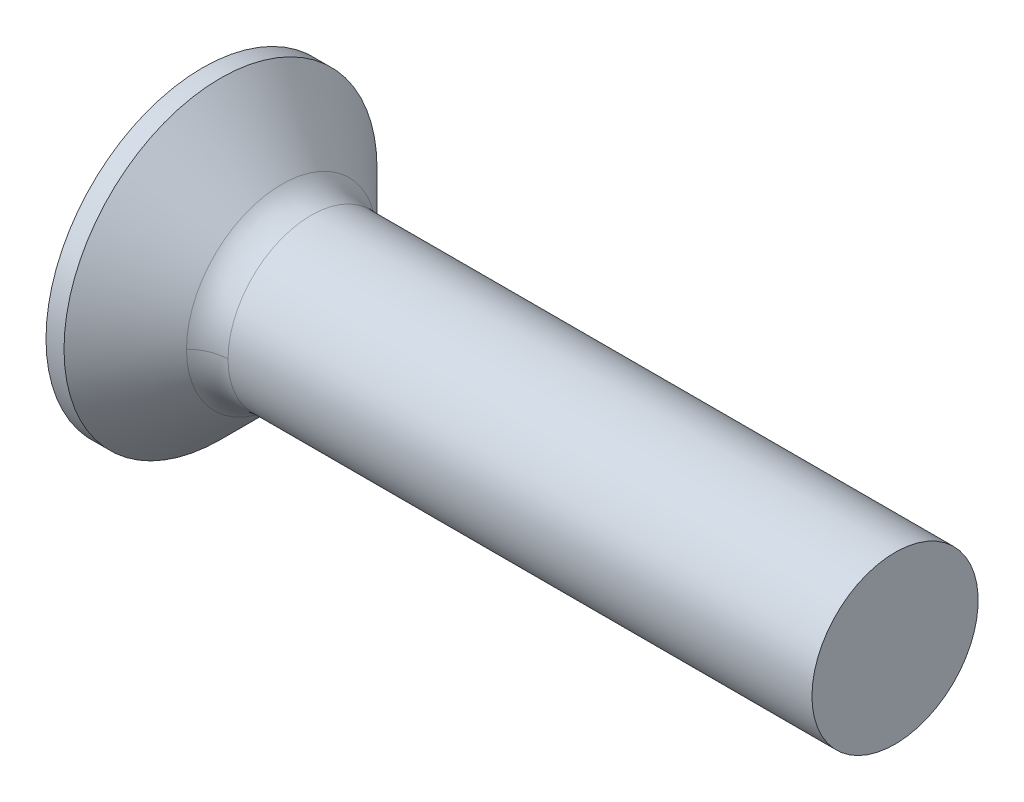
ISO-10303-21;
HEADER;
FILE_DESCRIPTION(('STEP AP214'),'2;1');
FILE_NAME('part.step','',(''),(''),'','','');
FILE_SCHEMA(('AUTOMOTIVE_DESIGN { 1 0 10303 214 1 1 1 1 }'));
ENDSEC;
DATA;
#1=APPLICATION_CONTEXT('core data for automotive mechanical design processes');
#2=APPLICATION_PROTOCOL_DEFINITION('international standard','automotive_design',2000,#1);
#3=PRODUCT_CONTEXT('',#1,'mechanical');
#4=PRODUCT('Part','Part','',(#3));
#5=PRODUCT_RELATED_PRODUCT_CATEGORY('part','',(#4));
#6=PRODUCT_DEFINITION_FORMATION('','',#4);
#7=PRODUCT_DEFINITION_CONTEXT('part definition',#1,'design');
#8=PRODUCT_DEFINITION('design','',#6,#7);
#9=PRODUCT_DEFINITION_SHAPE('','',#8);
#10=(LENGTH_UNIT() NAMED_UNIT(*) SI_UNIT(.MILLI.,.METRE.));
#11=(NAMED_UNIT(*) PLANE_ANGLE_UNIT() SI_UNIT($,.RADIAN.));
#12=(NAMED_UNIT(*) SI_UNIT($,.STERADIAN.) SOLID_ANGLE_UNIT());
#13=UNCERTAINTY_MEASURE_WITH_UNIT(LENGTH_MEASURE(1.E-05),#10,'distance_accuracy_value','');
#14=(GEOMETRIC_REPRESENTATION_CONTEXT(3) GLOBAL_UNCERTAINTY_ASSIGNED_CONTEXT((#13)) GLOBAL_UNIT_ASSIGNED_CONTEXT((#10,
#11,#12)) REPRESENTATION_CONTEXT('',''));
#15=CARTESIAN_POINT('',(0.,0.,0.));
#16=DIRECTION('',(0.,0.,1.));
#17=DIRECTION('',(1.,0.,0.));
#18=AXIS2_PLACEMENT_3D('',#15,#16,#17);
#19=CARTESIAN_POINT('',(25.,-3.036,3.036));
#20=DIRECTION('',(1.,0.,0.));
#21=DIRECTION('',(0.,0.,-1.));
#22=AXIS2_PLACEMENT_3D('',#19,#20,#21);
#23=PLANE('',#22);
#24=CARTESIAN_POINT('',(25.,0.,0.));
#25=DIRECTION('',(-1.,0.,0.));
#26=DIRECTION('',(0.,0.,1.));
#27=AXIS2_PLACEMENT_3D('',#24,#25,#26);
#28=CIRCLE('',#27,3.);
#29=CARTESIAN_POINT('',(25.,0.,3.));
#30=VERTEX_POINT('',#29);
#31=EDGE_CURVE('E20',#30,#30,#28,.F.);
#32=ORIENTED_EDGE('',*,*,#31,.T.);
#33=EDGE_LOOP('',(#32));
#34=FACE_BOUND('',#33,.T.);
#35=ADVANCED_FACE('F16',(#34),#23,.T.);
#36=CARTESIAN_POINT('',(25.,0.,0.));
#37=DIRECTION('',(-1.,0.,0.));
#38=DIRECTION('',(0.,0.,1.));
#39=AXIS2_PLACEMENT_3D('',#36,#37,#38);
#40=CYLINDRICAL_SURFACE('',#39,3.);
#41=ORIENTED_EDGE('',*,*,#31,.F.);
#42=EDGE_LOOP('',(#41));
#43=FACE_BOUND('',#42,.T.);
#44=CARTESIAN_POINT('',(3.92132034347785,0.,0.));
#45=DIRECTION('',(1.,0.,0.));
#46=DIRECTION('',(0.,0.,-1.));
#47=AXIS2_PLACEMENT_3D('',#44,#45,#46);
#48=CIRCLE('',#47,2.99999999996667);
#49=CARTESIAN_POINT('',(3.92132034360542,-3.07655142772997E-10,-2.999999999975));
#50=VERTEX_POINT('',#49);
#51=CARTESIAN_POINT('',(3.9213203434734,-1.346904426431E-10,2.999999999975));
#52=VERTEX_POINT('',#51);
#53=EDGE_CURVE('E250',#50,#52,#48,.T.);
#54=ORIENTED_EDGE('',*,*,#53,.T.);
#55=CARTESIAN_POINT('',(3.92132034347785,0.,0.));
#56=DIRECTION('',(1.,0.,0.));
#57=DIRECTION('',(0.,0.,-1.));
#58=AXIS2_PLACEMENT_3D('',#55,#56,#57);
#59=CIRCLE('',#58,2.99999999996667);
#60=EDGE_CURVE('E239',#52,#50,#59,.T.);
#61=ORIENTED_EDGE('',*,*,#60,.T.);
#62=EDGE_LOOP('',(#54,#61));
#63=FACE_BOUND('',#62,.T.);
#64=ADVANCED_FACE('F518',(#43,#63),#40,.T.);
#65=CARTESIAN_POINT('',(4.071070469,0.,3.007493752));
#66=CARTESIAN_POINT('',(4.071070469,6.014987504,3.007493752));
#67=CARTESIAN_POINT('',(4.071070469,6.014987504,-3.007493752));
#68=CARTESIAN_POINT('',(4.071070469,0.,-3.007493752));
#69=CARTESIAN_POINT('',(3.559894839,0.,2.956205113));
#70=CARTESIAN_POINT('',(3.559894839,5.912410226,2.956205113));
#71=CARTESIAN_POINT('',(3.559894839,5.912410226,-2.956205113));
#72=CARTESIAN_POINT('',(3.559894839,0.,-2.956205113));
#73=CARTESIAN_POINT('',(3.085258935,0.,3.152805742));
#74=CARTESIAN_POINT('',(3.085258935,6.305611483,3.152805742));
#75=CARTESIAN_POINT('',(3.085258935,6.305611483,-3.152805742));
#76=CARTESIAN_POINT('',(3.085258935,0.,-3.152805742));
#77=CARTESIAN_POINT('',(2.760069726,0.,3.55052804));
#78=CARTESIAN_POINT('',(2.760069726,7.10105608,3.55052804));
#79=CARTESIAN_POINT('',(2.760069726,7.10105608,-3.55052804));
#80=CARTESIAN_POINT('',(2.760069726,0.,-3.55052804));
#81=(BOUNDED_SURFACE() B_SPLINE_SURFACE(3,3,((#65,#66,#67,#68),(#69,#70,#71,#72),(#73,#74,#75,
#76),(#77,#78,#79,#80)),.UNSPECIFIED.,.F.,.F.,.F.) B_SPLINE_SURFACE_WITH_KNOTS((4,4),(4,4),(0.,
1.),(0.,1.),.UNSPECIFIED.) GEOMETRIC_REPRESENTATION_ITEM() RATIONAL_B_SPLINE_SURFACE(((1.,
0.333333333333333,0.333333333333333,1.),(0.920706259011135,0.306902086337045,0.306902086337045,
0.920706259011135),(0.920706259011135,0.306902086337045,0.306902086337045,0.920706259011135),
(1.,0.333333333333333,0.333333333333333,1.))) REPRESENTATION_ITEM('') SURFACE());
#82=CARTESIAN_POINT('',(2.86066017200004,0.,0.));
#83=DIRECTION('',(-1.,0.,0.));
#84=DIRECTION('',(0.,0.,1.));
#85=AXIS2_PLACEMENT_3D('',#82,#83,#84);
#86=CIRCLE('',#85,3.439339828);
#87=CARTESIAN_POINT('',(2.86066017203004,-1.05813058582819E-09,-3.43933982801549));
#88=VERTEX_POINT('',#87);
#89=CARTESIAN_POINT('',(2.86066017202489,-3.08830802555573E-10,3.43933982802064));
#90=VERTEX_POINT('',#89);
#91=EDGE_CURVE('E227',#88,#90,#86,.F.);
#92=CARTESIAN_POINT('',(4.071070469,0.,3.007493752));
#93=CARTESIAN_POINT('',(3.559894839,0.,2.956205113));
#94=CARTESIAN_POINT('',(3.085258935,0.,3.152805742));
#95=CARTESIAN_POINT('',(2.760069726,0.,3.55052804));
#96=(BOUNDED_CURVE() B_SPLINE_CURVE(3,(#92,#93,#94,#95),.UNSPECIFIED.,.F.,
.F.) B_SPLINE_CURVE_WITH_KNOTS((4,4),(0.,1.),
.UNSPECIFIED.) CURVE() GEOMETRIC_REPRESENTATION_ITEM() RATIONAL_B_SPLINE_CURVE((1.,
0.920706259011135,0.920706259011135,1.)) REPRESENTATION_ITEM(''));
#97=EDGE_CURVE('E244',#90,#52,#96,.F.);
#98=CARTESIAN_POINT('',(4.071070469,0.,-3.007493752));
#99=CARTESIAN_POINT('',(3.559894839,0.,-2.956205113));
#100=CARTESIAN_POINT('',(3.085258935,0.,-3.152805742));
#101=CARTESIAN_POINT('',(2.760069726,0.,-3.55052804));
#102=(BOUNDED_CURVE() B_SPLINE_CURVE(3,(#98,#99,#100,#101),.UNSPECIFIED.,.F.,
.F.) B_SPLINE_CURVE_WITH_KNOTS((4,4),(0.,1.),
.UNSPECIFIED.) CURVE() GEOMETRIC_REPRESENTATION_ITEM() RATIONAL_B_SPLINE_CURVE((1.,
0.920706259011135,0.920706259011135,1.)) REPRESENTATION_ITEM(''));
#103=EDGE_CURVE('E230',#50,#88,#102,.T.);
#104=ORIENTED_EDGE('',*,*,#91,.T.);
#105=ORIENTED_EDGE('',*,*,#97,.T.);
#106=ORIENTED_EDGE('',*,*,#53,.F.);
#107=ORIENTED_EDGE('',*,*,#103,.T.);
#108=EDGE_LOOP('',(#104,#105,#106,#107));
#109=FACE_BOUND('',#108,.T.);
#110=ADVANCED_FACE('F502',(#109),#81,.F.);
#111=CARTESIAN_POINT('',(4.071070469,0.,-3.007493752));
#112=CARTESIAN_POINT('',(4.071070469,-6.014987504,-3.007493752));
#113=CARTESIAN_POINT('',(4.071070469,-6.014987504,3.007493752));
#114=CARTESIAN_POINT('',(4.071070469,0.,3.007493752));
#115=CARTESIAN_POINT('',(3.559894839,0.,-2.956205113));
#116=CARTESIAN_POINT('',(3.559894839,-5.912410226,-2.956205113));
#117=CARTESIAN_POINT('',(3.559894839,-5.912410226,2.956205113));
#118=CARTESIAN_POINT('',(3.559894839,0.,2.956205113));
#119=CARTESIAN_POINT('',(3.085258935,0.,-3.152805742));
#120=CARTESIAN_POINT('',(3.085258935,-6.305611483,-3.152805742));
#121=CARTESIAN_POINT('',(3.085258935,-6.305611483,3.152805742));
#122=CARTESIAN_POINT('',(3.085258935,0.,3.152805742));
#123=CARTESIAN_POINT('',(2.760069726,0.,-3.55052804));
#124=CARTESIAN_POINT('',(2.760069726,-7.10105608,-3.55052804));
#125=CARTESIAN_POINT('',(2.760069726,-7.10105608,3.55052804));
#126=CARTESIAN_POINT('',(2.760069726,0.,3.55052804));
#127=(BOUNDED_SURFACE() B_SPLINE_SURFACE(3,3,((#111,#112,#113,#114),(#115,#116,#117,#118),(#119,
#120,#121,#122),(#123,#124,#125,#126)),.UNSPECIFIED.,.F.,.F.,
.F.) B_SPLINE_SURFACE_WITH_KNOTS((4,4),(4,4),(0.,1.),(0.,1.),
.UNSPECIFIED.) GEOMETRIC_REPRESENTATION_ITEM() RATIONAL_B_SPLINE_SURFACE(((1.,0.333333333333333,
0.333333333333333,1.),(0.920706259011135,0.306902086337045,0.306902086337045,0.920706259011135),
(0.920706259011135,0.306902086337045,0.306902086337045,0.920706259011135),(1.,0.333333333333333,
0.333333333333333,1.))) REPRESENTATION_ITEM('') SURFACE());
#128=CARTESIAN_POINT('',(2.86066017200004,0.,0.));
#129=DIRECTION('',(-1.,0.,0.));
#130=DIRECTION('',(0.,0.,1.));
#131=AXIS2_PLACEMENT_3D('',#128,#129,#130);
#132=CIRCLE('',#131,3.439339828);
#133=EDGE_CURVE('E223',#90,#88,#132,.F.);
#134=ORIENTED_EDGE('',*,*,#103,.F.);
#135=ORIENTED_EDGE('',*,*,#60,.F.);
#136=ORIENTED_EDGE('',*,*,#97,.F.);
#137=ORIENTED_EDGE('',*,*,#133,.T.);
#138=EDGE_LOOP('',(#134,#135,#136,#137));
#139=FACE_BOUND('',#138,.T.);
#140=ADVANCED_FACE('F495',(#139),#127,.F.);
#141=CARTESIAN_POINT('',(2.860660172,0.,0.));
#142=DIRECTION('',(-1.,0.,0.));
#143=DIRECTION('',(0.,-1.,0.));
#144=AXIS2_PLACEMENT_3D('',#141,#142,#143);
#145=CONICAL_SURFACE('',#144,3.439339828,0.785398163397448);
#146=ORIENTED_EDGE('',*,*,#133,.F.);
#147=ORIENTED_EDGE('',*,*,#91,.F.);
#148=EDGE_LOOP('',(#146,#147));
#149=FACE_BOUND('',#148,.T.);
#150=CARTESIAN_POINT('',(0.65,0.,0.));
#151=DIRECTION('',(-1.,0.,0.));
#152=DIRECTION('',(0.,0.,1.));
#153=AXIS2_PLACEMENT_3D('',#150,#151,#152);
#154=CIRCLE('',#153,5.65);
#155=CARTESIAN_POINT('',(0.65,0.,5.65));
#156=VERTEX_POINT('',#155);
#157=EDGE_CURVE('E209',#156,#156,#154,.F.);
#158=ORIENTED_EDGE('',*,*,#157,.T.);
#159=EDGE_LOOP('',(#158));
#160=FACE_BOUND('',#159,.T.);
#161=ADVANCED_FACE('F493',(#149,#160),#145,.T.);
#162=CARTESIAN_POINT('',(3.45,-1.579893512,-0.71));
#163=DIRECTION('',(-0.446197800689229,0.894934367794698,0.));
#164=DIRECTION('',(-0.894934367794698,-0.446197800689229,0.));
#165=AXIS2_PLACEMENT_3D('',#162,#163,#164);
#166=PLANE('',#165);
#167=DIRECTION('',(-0.894934367740282,-0.44619780079837,0.));
#168=VECTOR('',#167,1.);
#169=CARTESIAN_POINT('',(3.45,-1.57989351138299,0.71));
#170=LINE('',#169,#168);
#171=CARTESIAN_POINT('',(3.45,-1.5798935116915,0.71));
#172=VERTEX_POINT('',#171);
#173=CARTESIAN_POINT('',(-9.15153369751565E-12,-3.29999999998164,0.710000002242601));
#174=VERTEX_POINT('',#173);
#175=EDGE_CURVE('E206',#172,#174,#170,.T.);
#176=ORIENTED_EDGE('',*,*,#175,.F.);
#177=DIRECTION('',(0.,0.,-1.));
#178=VECTOR('',#177,1.);
#179=CARTESIAN_POINT('',(3.45,-1.579893512,0.));
#180=LINE('',#179,#178);
#181=CARTESIAN_POINT('',(3.45,-1.5798935116915,-0.71));
#182=VERTEX_POINT('',#181);
#183=EDGE_CURVE('E221',#172,#182,#180,.T.);
#184=ORIENTED_EDGE('',*,*,#183,.T.);
#185=DIRECTION('',(0.894934367740282,0.44619780079837,0.));
#186=VECTOR('',#185,1.);
#187=CARTESIAN_POINT('',(0.,-3.29999999990833,-0.71));
#188=LINE('',#187,#186);
#189=CARTESIAN_POINT('',(-9.15155371455694E-12,-3.29999999998164,-0.7100000022426));
#190=VERTEX_POINT('',#189);
#191=EDGE_CURVE('E158',#190,#182,#188,.T.);
#192=ORIENTED_EDGE('',*,*,#191,.F.);
#193=DIRECTION('',(0.,0.,1.));
#194=VECTOR('',#193,1.);
#195=CARTESIAN_POINT('',(0.,-3.3,0.));
#196=LINE('',#195,#194);
#197=EDGE_CURVE('E164',#190,#174,#196,.T.);
#198=ORIENTED_EDGE('',*,*,#197,.T.);
#199=EDGE_LOOP('',(#176,#184,#192,#198));
#200=FACE_BOUND('',#199,.T.);
#201=ADVANCED_FACE('F481',(#200),#166,.T.);
#202=CARTESIAN_POINT('',(3.45,0.,0.));
#203=DIRECTION('',(-1.,0.,0.));
#204=DIRECTION('',(0.,0.,1.));
#205=AXIS2_PLACEMENT_3D('',#202,#203,#204);
#206=CONICAL_SURFACE('',#205,1.2805,0.0698131700206101);
#207=CARTESIAN_POINT('',(0.,0.,0.));
#208=DIRECTION('',(-1.,0.,0.));
#209=DIRECTION('',(0.,0.,1.));
#210=AXIS2_PLACEMENT_3D('',#207,#208,#209);
#211=CIRCLE('',#210,1.521747501);
#212=CARTESIAN_POINT('',(-1.98757490879553E-11,-0.7100000022426,-1.34596264941472));
#213=VERTEX_POINT('',#212);
#214=CARTESIAN_POINT('',(-2.0018081073557E-11,-1.34596264941473,-0.7100000022426));
#215=VERTEX_POINT('',#214);
#216=EDGE_CURVE('E138',#213,#215,#211,.T.);
#217=ORIENTED_EDGE('',*,*,#216,.T.);
#218=CARTESIAN_POINT('',(3.44999999996933,-1.06563607763892,-0.709999999965281));
#219=CARTESIAN_POINT('',(3.05239804319664,-1.09903290978623,-0.709999999987832));
#220=CARTESIAN_POINT('',(2.65475821752246,-1.13197492179622,-0.709999999996809));
#221=CARTESIAN_POINT('',(1.859418568149,-1.19711780637158,-0.710000000003191));
#222=CARTESIAN_POINT('',(1.46171874456479,-1.22931868034064,-0.710000000000595));
#223=CARTESIAN_POINT('',(0.886672014067367,-1.2754623780766,-0.709999999999735));
#224=CARTESIAN_POINT('',(0.70934344088065,-1.2896345562043,-0.709999999999868));
#225=CARTESIAN_POINT('',(0.354677833209052,-1.31787453536712,-0.710000000000133));
#226=CARTESIAN_POINT('',(0.177340798717209,-1.33194233631483,-0.710000000000265));
#227=CARTESIAN_POINT('',(-4.00360912278943E-11,-1.34596265059929,-0.71));
#228=B_SPLINE_CURVE_WITH_KNOTS('',3,(#218,#219,#220,#221,#222,#223,#224,#225,#226,#227),
.UNSPECIFIED.,.F.,.F.,(4,2,2,2,4),(0.,1.19700553542681,2.39400880358524,2.92769077313542,
3.46137318953635),.UNSPECIFIED.);
#229=CARTESIAN_POINT('',(3.44999999999998,-1.06563607782568,-0.709999999743873));
#230=VERTEX_POINT('',#229);
#231=EDGE_CURVE('E144',#230,#215,#228,.T.);
#232=ORIENTED_EDGE('',*,*,#231,.F.);
#233=CARTESIAN_POINT('',(3.44999999999995,0.,0.));
#234=DIRECTION('',(-1.,0.,0.));
#235=DIRECTION('',(0.,0.,1.));
#236=AXIS2_PLACEMENT_3D('',#233,#234,#235);
#237=CIRCLE('',#236,1.2805);
#238=CARTESIAN_POINT('',(3.44999999999995,-0.709999999757469,-1.06563607781662));
#239=VERTEX_POINT('',#238);
#240=EDGE_CURVE('E149',#230,#239,#237,.F.);
#241=ORIENTED_EDGE('',*,*,#240,.T.);
#242=CARTESIAN_POINT('',(-3.97514937370692E-11,-0.71,-1.34596265059927));
#243=CARTESIAN_POINT('',(0.472697147041394,-0.71,-1.30857045299318));
#244=CARTESIAN_POINT('',(0.945371396486863,-0.71,-1.2708795223401));
#245=CARTESIAN_POINT('',(1.89064711681851,-0.71,-1.19461362364889));
#246=CARTESIAN_POINT('',(2.36324858790939,-0.71,-1.15603865814475));
#247=CARTESIAN_POINT('',(3.04054381210254,-0.71,-1.09991132788619));
#248=CARTESIAN_POINT('',(3.24527698184166,-0.71,-1.08283447895016));
#249=CARTESIAN_POINT('',(3.44999999997136,-0.71,-1.06563607765744));
#250=B_SPLINE_CURVE_WITH_KNOTS('',3,(#242,#243,#244,#245,#246,#247,#248,#249),.UNSPECIFIED.,.F.,
.F.,(4,2,2,4),(0.,1.42252243057653,2.84504078416987,3.4613730974833),.UNSPECIFIED.);
#251=EDGE_CURVE('E146',#213,#239,#250,.T.);
#252=ORIENTED_EDGE('',*,*,#251,.F.);
#253=EDGE_LOOP('',(#217,#232,#241,#252));
#254=FACE_BOUND('',#253,.T.);
#255=ADVANCED_FACE('F143',(#254),#206,.F.);
#256=CARTESIAN_POINT('',(3.45,0.71,-1.579893512));
#257=DIRECTION('',(-0.446197800689229,0.,0.894934367794698));
#258=DIRECTION('',(-0.894934367794698,0.,-0.446197800689229));
#259=AXIS2_PLACEMENT_3D('',#256,#257,#258);
#260=PLANE('',#259);
#261=DIRECTION('',(-0.894934367740282,0.,-0.44619780079837));
#262=VECTOR('',#261,1.);
#263=CARTESIAN_POINT('',(3.45,-0.71,-1.57989351138299));
#264=LINE('',#263,#262);
#265=CARTESIAN_POINT('',(3.45,-0.71,-1.5798935116915));
#266=VERTEX_POINT('',#265);
#267=CARTESIAN_POINT('',(-9.15153369751565E-12,-0.7100000022426,-3.29999999998164));
#268=VERTEX_POINT('',#267);
#269=EDGE_CURVE('E202',#266,#268,#264,.T.);
#270=ORIENTED_EDGE('',*,*,#269,.F.);
#271=DIRECTION('',(0.,1.,0.));
#272=VECTOR('',#271,1.);
#273=CARTESIAN_POINT('',(3.45,0.,-1.579893512));
#274=LINE('',#273,#272);
#275=CARTESIAN_POINT('',(3.45,0.71,-1.5798935116915));
#276=VERTEX_POINT('',#275);
#277=EDGE_CURVE('E218',#266,#276,#274,.T.);
#278=ORIENTED_EDGE('',*,*,#277,.T.);
#279=DIRECTION('',(0.894934367740282,0.,0.44619780079837));
#280=VECTOR('',#279,1.);
#281=CARTESIAN_POINT('',(0.,0.71,-3.29999999990833));
#282=LINE('',#281,#280);
#283=CARTESIAN_POINT('',(-9.15155371455694E-12,0.710000002242601,-3.29999999998164));
#284=VERTEX_POINT('',#283);
#285=EDGE_CURVE('E381',#284,#276,#282,.T.);
#286=ORIENTED_EDGE('',*,*,#285,.F.);
#287=DIRECTION('',(0.,-1.,0.));
#288=VECTOR('',#287,1.);
#289=CARTESIAN_POINT('',(0.,0.,-3.3));
#290=LINE('',#289,#288);
#291=EDGE_CURVE('E148',#284,#268,#290,.T.);
#292=ORIENTED_EDGE('',*,*,#291,.T.);
#293=EDGE_LOOP('',(#270,#278,#286,#292));
#294=FACE_BOUND('',#293,.T.);
#295=ADVANCED_FACE('F402',(#294),#260,.T.);
#296=CARTESIAN_POINT('',(3.45,0.,0.));
#297=DIRECTION('',(-1.,0.,0.));
#298=DIRECTION('',(0.,0.,1.));
#299=AXIS2_PLACEMENT_3D('',#296,#297,#298);
#300=CONICAL_SURFACE('',#299,1.2805,0.0698131700206101);
#301=CARTESIAN_POINT('',(3.44999999999995,0.,0.));
#302=DIRECTION('',(-1.,0.,0.));
#303=DIRECTION('',(0.,0.,1.));
#304=AXIS2_PLACEMENT_3D('',#301,#302,#303);
#305=CIRCLE('',#304,1.2805);
#306=CARTESIAN_POINT('',(3.44999999999998,0.709999999853156,-1.06563607775287));
#307=VERTEX_POINT('',#306);
#308=CARTESIAN_POINT('',(3.44999999999352,1.06563607753498,-0.710000000181004));
#309=VERTEX_POINT('',#308);
#310=EDGE_CURVE('E213',#307,#309,#305,.F.);
#311=ORIENTED_EDGE('',*,*,#310,.T.);
#312=CARTESIAN_POINT('',(-4.20398786480878E-11,1.34596265059945,-0.71));
#313=CARTESIAN_POINT('',(0.472697147039157,1.30857045299336,-0.71));
#314=CARTESIAN_POINT('',(0.945371396484674,1.27087952234027,-0.71));
#315=CARTESIAN_POINT('',(1.89064711681642,1.19461362364906,-0.71));
#316=CARTESIAN_POINT('',(2.36324858790735,1.15603865814491,-0.71));
#317=CARTESIAN_POINT('',(3.04054381210645,1.09991132788587,-0.71));
#318=CARTESIAN_POINT('',(3.24527698185149,1.08283447894934,-0.71));
#319=CARTESIAN_POINT('',(3.44999999998709,1.06563607765612,-0.71));
#320=B_SPLINE_CURVE_WITH_KNOTS('',3,(#312,#313,#314,#315,#316,#317,#318,#319),.UNSPECIFIED.,.F.,
.F.,(4,2,2,4),(0.,1.42252243057668,2.84504078417017,3.46137309750138),.UNSPECIFIED.);
#321=CARTESIAN_POINT('',(-2.10199421441777E-11,1.34596264941481,-0.7100000022426));
#322=VERTEX_POINT('',#321);
#323=EDGE_CURVE('E197',#322,#309,#320,.T.);
#324=ORIENTED_EDGE('',*,*,#323,.F.);
#325=CARTESIAN_POINT('',(0.,0.,0.));
#326=DIRECTION('',(-1.,0.,0.));
#327=DIRECTION('',(0.,0.,1.));
#328=AXIS2_PLACEMENT_3D('',#325,#326,#327);
#329=CIRCLE('',#328,1.521747501);
#330=CARTESIAN_POINT('',(-2.44523019773076E-11,0.710000002242601,-1.34596264941508));
#331=VERTEX_POINT('',#330);
#332=EDGE_CURVE('E216',#322,#331,#329,.T.);
#333=ORIENTED_EDGE('',*,*,#332,.T.);
#334=CARTESIAN_POINT('',(3.44999999997501,0.710000000001709,-1.06563607765805));
#335=CARTESIAN_POINT('',(3.0523980432014,0.710000000000599,-1.09903290979271));
#336=CARTESIAN_POINT('',(2.65475821752692,0.710000000000157,-1.13197492179766));
#337=CARTESIAN_POINT('',(1.8594185681534,0.709999999999843,-1.19711780636942));
#338=CARTESIAN_POINT('',(1.46171874456944,0.709999999999971,-1.22931868033993));
#339=CARTESIAN_POINT('',(0.88667201406989,0.710000000000013,-1.27546237807654));
#340=CARTESIAN_POINT('',(0.709343440880891,0.710000000000007,-1.28963455620435));
#341=CARTESIAN_POINT('',(0.354677833204729,0.709999999999994,-1.31787453536739));
#342=CARTESIAN_POINT('',(0.177340798710604,0.709999999999987,-1.3319423363152));
#343=CARTESIAN_POINT('',(-4.89046651199288E-11,0.71,-1.34596265059999));
#344=B_SPLINE_CURVE_WITH_KNOTS('',3,(#334,#335,#336,#337,#338,#339,#340,#341,#342,#343),
.UNSPECIFIED.,.F.,.F.,(4,2,2,2,4),(0.,1.19700553542644,2.39400880358452,2.92769077314155,
3.46137318954933),.UNSPECIFIED.);
#345=EDGE_CURVE('E201',#307,#331,#344,.T.);
#346=ORIENTED_EDGE('',*,*,#345,.F.);
#347=EDGE_LOOP('',(#311,#324,#333,#346));
#348=FACE_BOUND('',#347,.T.);
#349=ADVANCED_FACE('F397',(#348),#300,.F.);
#350=CARTESIAN_POINT('',(0.,3.3,-0.71));
#351=DIRECTION('',(-0.446197800689229,-0.894934367794698,0.));
#352=DIRECTION('',(0.894934367794698,-0.446197800689229,0.));
#353=AXIS2_PLACEMENT_3D('',#350,#351,#352);
#354=PLANE('',#353);
#355=DIRECTION('',(-0.894934367740282,0.44619780079837,0.));
#356=VECTOR('',#355,1.);
#357=CARTESIAN_POINT('',(3.45,1.57989351138299,-0.71));
#358=LINE('',#357,#356);
#359=CARTESIAN_POINT('',(3.45,1.5798935116915,-0.71));
#360=VERTEX_POINT('',#359);
#361=CARTESIAN_POINT('',(-9.15153369751565E-12,3.29999999998164,-0.7100000022426));
#362=VERTEX_POINT('',#361);
#363=EDGE_CURVE('E194',#360,#362,#358,.T.);
#364=ORIENTED_EDGE('',*,*,#363,.F.);
#365=DIRECTION('',(0.,0.,1.));
#366=VECTOR('',#365,1.);
#367=CARTESIAN_POINT('',(3.45,1.579893512,0.));
#368=LINE('',#367,#366);
#369=CARTESIAN_POINT('',(3.45,1.5798935116915,0.71));
#370=VERTEX_POINT('',#369);
#371=EDGE_CURVE('E212',#360,#370,#368,.T.);
#372=ORIENTED_EDGE('',*,*,#371,.T.);
#373=DIRECTION('',(0.894934367740282,-0.44619780079837,0.));
#374=VECTOR('',#373,1.);
#375=CARTESIAN_POINT('',(0.,3.29999999990833,0.71));
#376=LINE('',#375,#374);
#377=CARTESIAN_POINT('',(-9.15155371455694E-12,3.29999999998164,0.710000002242601));
#378=VERTEX_POINT('',#377);
#379=EDGE_CURVE('E191',#378,#370,#376,.T.);
#380=ORIENTED_EDGE('',*,*,#379,.F.);
#381=DIRECTION('',(0.,0.,-1.));
#382=VECTOR('',#381,1.);
#383=CARTESIAN_POINT('',(0.,3.3,0.));
#384=LINE('',#383,#382);
#385=EDGE_CURVE('E210',#378,#362,#384,.T.);
#386=ORIENTED_EDGE('',*,*,#385,.T.);
#387=EDGE_LOOP('',(#364,#372,#380,#386));
#388=FACE_BOUND('',#387,.T.);
#389=ADVANCED_FACE('F401',(#388),#354,.T.);
#390=CARTESIAN_POINT('',(0.65,0.,0.));
#391=DIRECTION('',(-1.,0.,0.));
#392=DIRECTION('',(0.,0.,1.));
#393=AXIS2_PLACEMENT_3D('',#390,#391,#392);
#394=CYLINDRICAL_SURFACE('',#393,5.65);
#395=ORIENTED_EDGE('',*,*,#157,.F.);
#396=EDGE_LOOP('',(#395));
#397=FACE_BOUND('',#396,.T.);
#398=CARTESIAN_POINT('',(0.,0.,0.));
#399=DIRECTION('',(-1.,0.,0.));
#400=DIRECTION('',(0.,0.,1.));
#401=AXIS2_PLACEMENT_3D('',#398,#399,#400);
#402=CIRCLE('',#401,5.65);
#403=CARTESIAN_POINT('',(0.,0.,5.65));
#404=VERTEX_POINT('',#403);
#405=EDGE_CURVE('E421',#404,#404,#402,.T.);
#406=ORIENTED_EDGE('',*,*,#405,.F.);
#407=EDGE_LOOP('',(#406));
#408=FACE_BOUND('',#407,.T.);
#409=ADVANCED_FACE('F403',(#397,#408),#394,.T.);
#410=CARTESIAN_POINT('',(0.,-3.313406184,0.71));
#411=DIRECTION('',(0.,0.,-1.));
#412=DIRECTION('',(0.,1.,0.));
#413=AXIS2_PLACEMENT_3D('',#410,#411,#412);
#414=PLANE('',#413);
#415=DIRECTION('',(0.,-1.,0.));
#416=VECTOR('',#415,1.);
#417=CARTESIAN_POINT('',(3.45,-2.182818039,0.71));
#418=LINE('',#417,#416);
#419=CARTESIAN_POINT('',(3.44999999999998,-1.06563607774381,0.709999999866751));
#420=VERTEX_POINT('',#419);
#421=EDGE_CURVE('E207',#420,#172,#418,.T.);
#422=ORIENTED_EDGE('',*,*,#421,.T.);
#423=ORIENTED_EDGE('',*,*,#175,.T.);
#424=DIRECTION('',(0.,-1.,0.));
#425=VECTOR('',#424,1.);
#426=CARTESIAN_POINT('',(0.,0.,0.710000004485201));
#427=LINE('',#426,#425);
#428=CARTESIAN_POINT('',(-3.16977542704161E-11,-1.34596264941565,0.710000002242601));
#429=VERTEX_POINT('',#428);
#430=EDGE_CURVE('E167',#429,#174,#427,.T.);
#431=ORIENTED_EDGE('',*,*,#430,.F.);
#432=CARTESIAN_POINT('',(3.44999999997908,-1.06563607765719,0.71000000000074));
#433=CARTESIAN_POINT('',(3.05239804320558,-1.09903290979218,0.71000000000026));
#434=CARTESIAN_POINT('',(2.6547582175312,-1.13197492179726,0.710000000000068));
#435=CARTESIAN_POINT('',(1.85941856815787,-1.19711780636911,0.709999999999932));
#436=CARTESIAN_POINT('',(1.46171874457399,-1.22931868033957,0.709999999999987));
#437=CARTESIAN_POINT('',(0.88667201407134,-1.27546237807643,0.710000000000006));
#438=CARTESIAN_POINT('',(0.709343440879154,-1.28963455620449,0.710000000000003));
#439=CARTESIAN_POINT('',(0.354677833196615,-1.31787453536803,0.709999999999997));
#440=CARTESIAN_POINT('',(0.177340798699302,-1.3319423363161,0.709999999999995));
#441=CARTESIAN_POINT('',(-6.33953695709904E-11,-1.34596265060114,0.71));
#442=B_SPLINE_CURVE_WITH_KNOTS('',3,(#432,#433,#434,#435,#436,#437,#438,#439,#440,#441),
.UNSPECIFIED.,.F.,.F.,(4,2,2,2,4),(0.,1.19700553542617,2.39400880358399,2.92769077315061,
3.46137318956799),.UNSPECIFIED.);
#443=EDGE_CURVE('E190',#420,#429,#442,.T.);
#444=ORIENTED_EDGE('',*,*,#443,.F.);
#445=EDGE_LOOP('',(#422,#423,#431,#444));
#446=FACE_BOUND('',#445,.T.);
#447=ADVANCED_FACE('F422',(#446),#414,.T.);
#448=CARTESIAN_POINT('',(0.,-3.313406184,-0.71));
#449=DIRECTION('',(0.,0.,1.));
#450=DIRECTION('',(1.,0.,0.));
#451=AXIS2_PLACEMENT_3D('',#448,#449,#450);
#452=PLANE('',#451);
#453=DIRECTION('',(0.,1.,0.));
#454=VECTOR('',#453,1.);
#455=CARTESIAN_POINT('',(0.,0.,-0.710000004485199));
#456=LINE('',#455,#454);
#457=EDGE_CURVE('E154',#190,#215,#456,.T.);
#458=ORIENTED_EDGE('',*,*,#457,.F.);
#459=ORIENTED_EDGE('',*,*,#191,.T.);
#460=DIRECTION('',(0.,1.,0.));
#461=VECTOR('',#460,1.);
#462=CARTESIAN_POINT('',(3.45,-2.182818039,-0.71));
#463=LINE('',#462,#461);
#464=EDGE_CURVE('E156',#182,#230,#463,.T.);
#465=ORIENTED_EDGE('',*,*,#464,.T.);
#466=ORIENTED_EDGE('',*,*,#231,.T.);
#467=EDGE_LOOP('',(#458,#459,#465,#466));
#468=FACE_BOUND('',#467,.T.);
#469=ADVANCED_FACE('F152',(#468),#452,.T.);
#470=CARTESIAN_POINT('',(0.,-0.71,-3.313406184));
#471=DIRECTION('',(0.,1.,0.));
#472=DIRECTION('',(0.,0.,1.));
#473=AXIS2_PLACEMENT_3D('',#470,#471,#472);
#474=PLANE('',#473);
#475=DIRECTION('',(0.,0.,-1.));
#476=VECTOR('',#475,1.);
#477=CARTESIAN_POINT('',(3.45,-0.71,-2.182818039));
#478=LINE('',#477,#476);
#479=EDGE_CURVE('E203',#239,#266,#478,.T.);
#480=ORIENTED_EDGE('',*,*,#479,.T.);
#481=ORIENTED_EDGE('',*,*,#269,.T.);
#482=DIRECTION('',(0.,0.,-1.));
#483=VECTOR('',#482,1.);
#484=CARTESIAN_POINT('',(0.,-0.710000004485199,0.));
#485=LINE('',#484,#483);
#486=EDGE_CURVE('E166',#213,#268,#485,.T.);
#487=ORIENTED_EDGE('',*,*,#486,.F.);
#488=ORIENTED_EDGE('',*,*,#251,.T.);
#489=EDGE_LOOP('',(#480,#481,#487,#488));
#490=FACE_BOUND('',#489,.T.);
#491=ADVANCED_FACE('F431',(#490),#474,.T.);
#492=CARTESIAN_POINT('',(0.,0.71,-3.313406184));
#493=DIRECTION('',(0.,-1.,0.));
#494=DIRECTION('',(1.,0.,0.));
#495=AXIS2_PLACEMENT_3D('',#492,#493,#494);
#496=PLANE('',#495);
#497=DIRECTION('',(0.,0.,1.));
#498=VECTOR('',#497,1.);
#499=CARTESIAN_POINT('',(0.,0.710000004485201,0.));
#500=LINE('',#499,#498);
#501=EDGE_CURVE('E169',#284,#331,#500,.T.);
#502=ORIENTED_EDGE('',*,*,#501,.F.);
#503=ORIENTED_EDGE('',*,*,#285,.T.);
#504=DIRECTION('',(0.,0.,1.));
#505=VECTOR('',#504,1.);
#506=CARTESIAN_POINT('',(3.45,0.71,-2.182818039));
#507=LINE('',#506,#505);
#508=EDGE_CURVE('E198',#276,#307,#507,.T.);
#509=ORIENTED_EDGE('',*,*,#508,.T.);
#510=ORIENTED_EDGE('',*,*,#345,.T.);
#511=EDGE_LOOP('',(#502,#503,#509,#510));
#512=FACE_BOUND('',#511,.T.);
#513=ADVANCED_FACE('F380',(#512),#496,.T.);
#514=CARTESIAN_POINT('',(0.,1.052229894,-0.71));
#515=DIRECTION('',(0.,0.,1.));
#516=DIRECTION('',(1.,0.,0.));
#517=AXIS2_PLACEMENT_3D('',#514,#515,#516);
#518=PLANE('',#517);
#519=DIRECTION('',(0.,1.,0.));
#520=VECTOR('',#519,1.);
#521=CARTESIAN_POINT('',(3.45,2.182818039,-0.71));
#522=LINE('',#521,#520);
#523=EDGE_CURVE('E195',#309,#360,#522,.T.);
#524=ORIENTED_EDGE('',*,*,#523,.T.);
#525=ORIENTED_EDGE('',*,*,#363,.T.);
#526=DIRECTION('',(0.,1.,0.));
#527=VECTOR('',#526,1.);
#528=CARTESIAN_POINT('',(0.,0.,-0.710000004485199));
#529=LINE('',#528,#527);
#530=EDGE_CURVE('E371',#322,#362,#529,.T.);
#531=ORIENTED_EDGE('',*,*,#530,.F.);
#532=ORIENTED_EDGE('',*,*,#323,.T.);
#533=EDGE_LOOP('',(#524,#525,#531,#532));
#534=FACE_BOUND('',#533,.T.);
#535=ADVANCED_FACE('F319',(#534),#518,.T.);
#536=CARTESIAN_POINT('',(0.,1.052229894,0.71));
#537=DIRECTION('',(0.,0.,-1.));
#538=DIRECTION('',(0.,1.,0.));
#539=AXIS2_PLACEMENT_3D('',#536,#537,#538);
#540=PLANE('',#539);
#541=DIRECTION('',(0.,-1.,0.));
#542=VECTOR('',#541,1.);
#543=CARTESIAN_POINT('',(0.,0.,0.710000004485201));
#544=LINE('',#543,#542);
#545=CARTESIAN_POINT('',(0.,1.34596264941314,0.710000002242601));
#546=VERTEX_POINT('',#545);
#547=EDGE_CURVE('E178',#378,#546,#544,.T.);
#548=ORIENTED_EDGE('',*,*,#547,.F.);
#549=ORIENTED_EDGE('',*,*,#379,.T.);
#550=DIRECTION('',(0.,-1.,0.));
#551=VECTOR('',#550,1.);
#552=CARTESIAN_POINT('',(3.45,2.182818039,0.71));
#553=LINE('',#552,#551);
#554=CARTESIAN_POINT('',(3.44999999999218,1.06563607768071,0.709999999962439));
#555=VERTEX_POINT('',#554);
#556=EDGE_CURVE('E192',#370,#555,#553,.T.);
#557=ORIENTED_EDGE('',*,*,#556,.T.);
#558=CARTESIAN_POINT('',(-5.93884078238237E-11,1.34596265060082,0.71));
#559=CARTESIAN_POINT('',(0.472697147022186,1.30857045299471,0.71));
#560=CARTESIAN_POINT('',(0.94537139646808,1.2708795223416,0.71));
#561=CARTESIAN_POINT('',(1.89064711680058,1.19461362365035,0.71));
#562=CARTESIAN_POINT('',(2.36324858789189,1.15603865814618,0.71));
#563=CARTESIAN_POINT('',(3.0405438120955,1.09991132788678,0.71));
#564=CARTESIAN_POINT('',(3.24527698184466,1.08283447894991,0.71));
#565=CARTESIAN_POINT('',(3.44999999998439,1.06563607765634,0.71));
#566=B_SPLINE_CURVE_WITH_KNOTS('',3,(#558,#559,#560,#561,#562,#563,#564,#565),.UNSPECIFIED.,.F.,
.F.,(4,2,2,4),(0.,1.42252243057782,2.84504078417244,3.46137309751608),.UNSPECIFIED.);
#567=EDGE_CURVE('E304',#546,#555,#566,.T.);
#568=ORIENTED_EDGE('',*,*,#567,.F.);
#569=EDGE_LOOP('',(#548,#549,#557,#568));
#570=FACE_BOUND('',#569,.T.);
#571=ADVANCED_FACE('F314',(#570),#540,.T.);
#572=CARTESIAN_POINT('',(3.45,0.,0.));
#573=DIRECTION('',(-1.,0.,0.));
#574=DIRECTION('',(0.,0.,1.));
#575=AXIS2_PLACEMENT_3D('',#572,#573,#574);
#576=CONICAL_SURFACE('',#575,1.2805,0.0698131700206101);
#577=CARTESIAN_POINT('',(3.44999999999995,0.,0.));
#578=DIRECTION('',(-1.,0.,0.));
#579=DIRECTION('',(0.,0.,1.));
#580=AXIS2_PLACEMENT_3D('',#577,#578,#579);
#581=CIRCLE('',#580,1.2805);
#582=CARTESIAN_POINT('',(3.44999999999998,-0.710000000167409,1.06563607754349));
#583=VERTEX_POINT('',#582);
#584=EDGE_CURVE('E188',#583,#420,#581,.F.);
#585=ORIENTED_EDGE('',*,*,#584,.T.);
#586=ORIENTED_EDGE('',*,*,#443,.T.);
#587=CARTESIAN_POINT('',(0.,0.,0.));
#588=DIRECTION('',(-1.,0.,0.));
#589=DIRECTION('',(0.,0.,1.));
#590=AXIS2_PLACEMENT_3D('',#587,#588,#589);
#591=CIRCLE('',#590,1.521747501);
#592=CARTESIAN_POINT('',(-1.17565050384127E-12,-0.71,1.34596265059622));
#593=VERTEX_POINT('',#592);
#594=EDGE_CURVE('E171',#593,#429,#591,.F.);
#595=ORIENTED_EDGE('',*,*,#594,.F.);
#596=CARTESIAN_POINT('',(3.44999999998658,-0.71,1.06563607765616));
#597=CARTESIAN_POINT('',(3.05239804321327,-0.71,1.0990329097914));
#598=CARTESIAN_POINT('',(2.65475821753906,-0.71,1.13197492179657));
#599=CARTESIAN_POINT('',(1.85941856816606,-0.71,1.19711780636848));
#600=CARTESIAN_POINT('',(1.46171874458234,-0.71,1.2293186803389));
#601=CARTESIAN_POINT('',(0.886672014088613,-0.71,1.27546237807504));
#602=CARTESIAN_POINT('',(0.709343440905181,-0.71,1.28963455620241));
#603=CARTESIAN_POINT('',(0.35467783324015,-0.71,1.31787453536458));
#604=CARTESIAN_POINT('',(0.177340798751592,-0.71,1.33194233631196));
#605=CARTESIAN_POINT('',(-2.35122242110105E-12,-0.71,1.34596265059631));
#606=B_SPLINE_CURVE_WITH_KNOTS('',3,(#596,#597,#598,#599,#600,#601,#602,#603,#604,#605),
.UNSPECIFIED.,.F.,.F.,(4,2,2,2,4),(0.,1.19700553542568,2.39400880358301,2.92769077312329,
3.46137318951432),.UNSPECIFIED.);
#607=EDGE_CURVE('E283',#583,#593,#606,.T.);
#608=ORIENTED_EDGE('',*,*,#607,.F.);
#609=EDGE_LOOP('',(#585,#586,#595,#608));
#610=FACE_BOUND('',#609,.T.);
#611=ADVANCED_FACE('F300',(#610),#576,.F.);
#612=CARTESIAN_POINT('',(0.,-5.7178,-5.7178));
#613=DIRECTION('',(-1.,0.,0.));
#614=DIRECTION('',(0.,0.,1.));
#615=AXIS2_PLACEMENT_3D('',#612,#613,#614);
#616=PLANE('',#615);
#617=DIRECTION('',(0.,0.,-1.));
#618=VECTOR('',#617,1.);
#619=CARTESIAN_POINT('',(0.,0.71,2.182818039));
#620=LINE('',#619,#618);
#621=CARTESIAN_POINT('',(6.10087790472077E-12,0.71,3.30000000036533));
#622=VERTEX_POINT('',#621);
#623=CARTESIAN_POINT('',(0.,0.71,1.34596265059612));
#624=VERTEX_POINT('',#623);
#625=EDGE_CURVE('E282',#622,#624,#620,.T.);
#626=ORIENTED_EDGE('',*,*,#625,.F.);
#627=DIRECTION('',(0.,-1.,0.));
#628=VECTOR('',#627,1.);
#629=CARTESIAN_POINT('',(0.,0.,3.3000000011968));
#630=LINE('',#629,#628);
#631=CARTESIAN_POINT('',(-4.90329709705121E-11,-0.710000001495066,3.30000000039282));
#632=VERTEX_POINT('',#631);
#633=EDGE_CURVE('E175',#622,#632,#630,.T.);
#634=ORIENTED_EDGE('',*,*,#633,.T.);
#635=DIRECTION('',(0.,0.,1.));
#636=VECTOR('',#635,1.);
#637=CARTESIAN_POINT('',(0.,-0.71,2.182818039));
#638=LINE('',#637,#636);
#639=EDGE_CURVE('E352',#593,#632,#638,.T.);
#640=ORIENTED_EDGE('',*,*,#639,.F.);
#641=ORIENTED_EDGE('',*,*,#594,.T.);
#642=ORIENTED_EDGE('',*,*,#430,.T.);
#643=ORIENTED_EDGE('',*,*,#197,.F.);
#644=ORIENTED_EDGE('',*,*,#457,.T.);
#645=ORIENTED_EDGE('',*,*,#216,.F.);
#646=ORIENTED_EDGE('',*,*,#486,.T.);
#647=ORIENTED_EDGE('',*,*,#291,.F.);
#648=ORIENTED_EDGE('',*,*,#501,.T.);
#649=ORIENTED_EDGE('',*,*,#332,.F.);
#650=ORIENTED_EDGE('',*,*,#530,.T.);
#651=ORIENTED_EDGE('',*,*,#385,.F.);
#652=ORIENTED_EDGE('',*,*,#547,.T.);
#653=CARTESIAN_POINT('',(0.,0.,0.));
#654=DIRECTION('',(-1.,0.,0.));
#655=DIRECTION('',(0.,0.,1.));
#656=AXIS2_PLACEMENT_3D('',#653,#654,#655);
#657=CIRCLE('',#656,1.521747501);
#658=EDGE_CURVE('E312',#624,#546,#657,.T.);
#659=ORIENTED_EDGE('',*,*,#658,.F.);
#660=EDGE_LOOP('',(#626,#634,#640,#641,#642,#643,#644,#645,#646,#647,#648,#649,#650,#651,#652,#659));
#661=FACE_BOUND('',#660,.T.);
#662=ORIENTED_EDGE('',*,*,#405,.T.);
#663=EDGE_LOOP('',(#662));
#664=FACE_BOUND('',#663,.T.);
#665=ADVANCED_FACE('F161',(#661,#664),#616,.T.);
#666=CARTESIAN_POINT('',(3.45,0.,0.));
#667=DIRECTION('',(-1.,0.,0.));
#668=DIRECTION('',(0.,0.,1.));
#669=AXIS2_PLACEMENT_3D('',#666,#667,#668);
#670=CONICAL_SURFACE('',#669,1.2805,0.0698131700206101);
#671=ORIENTED_EDGE('',*,*,#658,.T.);
#672=ORIENTED_EDGE('',*,*,#567,.T.);
#673=CARTESIAN_POINT('',(3.44999999999995,0.,0.));
#674=DIRECTION('',(-1.,0.,0.));
#675=DIRECTION('',(0.,0.,1.));
#676=AXIS2_PLACEMENT_3D('',#673,#674,#675);
#677=CIRCLE('',#676,1.2805);
#678=CARTESIAN_POINT('',(3.4499999999915,0.710000000071721,1.06563607760796));
#679=VERTEX_POINT('',#678);
#680=EDGE_CURVE('E177',#555,#679,#677,.F.);
#681=ORIENTED_EDGE('',*,*,#680,.T.);
#682=CARTESIAN_POINT('',(-4.35488851240211E-12,0.71,1.34596265059647));
#683=CARTESIAN_POINT('',(0.47269714707602,0.71,1.30857045299043));
#684=CARTESIAN_POINT('',(0.945371396520719,0.71,1.27087952233739));
#685=CARTESIAN_POINT('',(1.89064711685082,0.71,1.19461362364626));
#686=CARTESIAN_POINT('',(2.36324858794093,0.71,1.15603865814216));
#687=CARTESIAN_POINT('',(3.04054381212694,0.71,1.09991132788416));
#688=CARTESIAN_POINT('',(3.24527698185971,0.71,1.08283447894865));
#689=CARTESIAN_POINT('',(3.44999999998304,0.71,1.06563607765646));
#690=B_SPLINE_CURVE_WITH_KNOTS('',3,(#682,#683,#684,#685,#686,#687,#688,#689),.UNSPECIFIED.,.F.,
.F.,(4,2,2,4),(0.,1.42252243057422,2.84504078416524,3.46137309745951),.UNSPECIFIED.);
#691=EDGE_CURVE('E274',#624,#679,#690,.T.);
#692=ORIENTED_EDGE('',*,*,#691,.F.);
#693=EDGE_LOOP('',(#671,#672,#681,#692));
#694=FACE_BOUND('',#693,.T.);
#695=ADVANCED_FACE('F293',(#694),#670,.F.);
#696=CARTESIAN_POINT('',(0.,-0.71,1.052229894));
#697=DIRECTION('',(0.,1.,0.));
#698=DIRECTION('',(0.,0.,1.));
#699=AXIS2_PLACEMENT_3D('',#696,#697,#698);
#700=PLANE('',#699);
#701=ORIENTED_EDGE('',*,*,#639,.T.);
#702=DIRECTION('',(-0.894934367794698,0.,0.446197800689229));
#703=VECTOR('',#702,1.);
#704=CARTESIAN_POINT('',(1.725,-0.71,2.439946756));
#705=LINE('',#704,#703);
#706=CARTESIAN_POINT('',(3.45000000004106,-0.71,1.57989351177386));
#707=VERTEX_POINT('',#706);
#708=EDGE_CURVE('E181',#707,#632,#705,.T.);
#709=ORIENTED_EDGE('',*,*,#708,.F.);
#710=DIRECTION('',(0.,0.,-1.));
#711=VECTOR('',#710,1.);
#712=CARTESIAN_POINT('',(3.45,-0.71,2.182818039));
#713=LINE('',#712,#711);
#714=EDGE_CURVE('E311',#707,#583,#713,.T.);
#715=ORIENTED_EDGE('',*,*,#714,.T.);
#716=ORIENTED_EDGE('',*,*,#607,.T.);
#717=EDGE_LOOP('',(#701,#709,#715,#716));
#718=FACE_BOUND('',#717,.T.);
#719=ADVANCED_FACE('F297',(#718),#700,.T.);
#720=CARTESIAN_POINT('',(0.,0.71,1.052229894));
#721=DIRECTION('',(0.,-1.,0.));
#722=DIRECTION('',(1.,0.,0.));
#723=AXIS2_PLACEMENT_3D('',#720,#721,#722);
#724=PLANE('',#723);
#725=DIRECTION('',(0.,0.,1.));
#726=VECTOR('',#725,1.);
#727=CARTESIAN_POINT('',(3.45,0.71,2.182818039));
#728=LINE('',#727,#726);
#729=CARTESIAN_POINT('',(3.45,0.71,1.57989351138299));
#730=VERTEX_POINT('',#729);
#731=EDGE_CURVE('E185',#679,#730,#728,.T.);
#732=ORIENTED_EDGE('',*,*,#731,.T.);
#733=DIRECTION('',(0.894934367794698,0.,-0.446197800689229));
#734=VECTOR('',#733,1.);
#735=CARTESIAN_POINT('',(1.725,0.71,2.439946756));
#736=LINE('',#735,#734);
#737=EDGE_CURVE('E184',#622,#730,#736,.T.);
#738=ORIENTED_EDGE('',*,*,#737,.F.);
#739=ORIENTED_EDGE('',*,*,#625,.T.);
#740=ORIENTED_EDGE('',*,*,#691,.T.);
#741=EDGE_LOOP('',(#732,#738,#739,#740));
#742=FACE_BOUND('',#741,.T.);
#743=ADVANCED_FACE('F290',(#742),#724,.T.);
#744=CARTESIAN_POINT('',(3.45,1.062550533,-0.71));
#745=DIRECTION('',(-1.,0.,0.));
#746=DIRECTION('',(0.,0.,1.));
#747=AXIS2_PLACEMENT_3D('',#744,#745,#746);
#748=PLANE('',#747);
#749=ORIENTED_EDGE('',*,*,#556,.F.);
#750=ORIENTED_EDGE('',*,*,#371,.F.);
#751=ORIENTED_EDGE('',*,*,#523,.F.);
#752=CARTESIAN_POINT('',(3.45,0.,0.));
#753=DIRECTION('',(-1.,0.,0.));
#754=DIRECTION('',(0.,0.,1.));
#755=AXIS2_PLACEMENT_3D('',#752,#753,#754);
#756=CIRCLE('',#755,1.2805);
#757=EDGE_CURVE('E271',#555,#309,#756,.T.);
#758=ORIENTED_EDGE('',*,*,#757,.F.);
#759=EDGE_LOOP('',(#749,#750,#751,#758));
#760=FACE_BOUND('',#759,.T.);
#761=ADVANCED_FACE('F331',(#760),#748,.T.);
#762=CARTESIAN_POINT('',(0.,0.71,3.3));
#763=DIRECTION('',(-0.446197800689229,0.,-0.894934367794698));
#764=DIRECTION('',(0.894934367794698,0.,-0.446197800689229));
#765=AXIS2_PLACEMENT_3D('',#762,#763,#764);
#766=PLANE('',#765);
#767=ORIENTED_EDGE('',*,*,#737,.T.);
#768=DIRECTION('',(0.,1.,0.));
#769=VECTOR('',#768,1.);
#770=CARTESIAN_POINT('',(3.45,0.,1.579893512));
#771=LINE('',#770,#769);
#772=EDGE_CURVE('E270',#707,#730,#771,.T.);
#773=ORIENTED_EDGE('',*,*,#772,.F.);
#774=ORIENTED_EDGE('',*,*,#708,.T.);
#775=ORIENTED_EDGE('',*,*,#633,.F.);
#776=EDGE_LOOP('',(#767,#773,#774,#775));
#777=FACE_BOUND('',#776,.T.);
#778=ADVANCED_FACE('F456',(#777),#766,.T.);
#779=CARTESIAN_POINT('',(3.45,-0.71,-1.579893512));
#780=DIRECTION('',(-1.,0.,0.));
#781=DIRECTION('',(0.,0.,1.));
#782=AXIS2_PLACEMENT_3D('',#779,#780,#781);
#783=PLANE('',#782);
#784=ORIENTED_EDGE('',*,*,#508,.F.);
#785=ORIENTED_EDGE('',*,*,#277,.F.);
#786=ORIENTED_EDGE('',*,*,#479,.F.);
#787=CARTESIAN_POINT('',(3.44999999999995,0.,0.));
#788=DIRECTION('',(-1.,0.,0.));
#789=DIRECTION('',(0.,0.,1.));
#790=AXIS2_PLACEMENT_3D('',#787,#788,#789);
#791=CIRCLE('',#790,1.28050000000014);
#792=EDGE_CURVE('E267',#307,#239,#791,.T.);
#793=ORIENTED_EDGE('',*,*,#792,.F.);
#794=EDGE_LOOP('',(#784,#785,#786,#793));
#795=FACE_BOUND('',#794,.T.);
#796=ADVANCED_FACE('F460',(#795),#783,.T.);
#797=CARTESIAN_POINT('',(3.45,-1.579893512,-0.71));
#798=DIRECTION('',(-1.,0.,0.));
#799=DIRECTION('',(0.,0.,1.));
#800=AXIS2_PLACEMENT_3D('',#797,#798,#799);
#801=PLANE('',#800);
#802=ORIENTED_EDGE('',*,*,#464,.F.);
#803=ORIENTED_EDGE('',*,*,#183,.F.);
#804=ORIENTED_EDGE('',*,*,#421,.F.);
#805=CARTESIAN_POINT('',(3.45,0.,0.));
#806=DIRECTION('',(-1.,0.,0.));
#807=DIRECTION('',(0.,0.,1.));
#808=AXIS2_PLACEMENT_3D('',#805,#806,#807);
#809=CIRCLE('',#808,1.2805);
#810=EDGE_CURVE('E26',#230,#420,#809,.T.);
#811=ORIENTED_EDGE('',*,*,#810,.F.);
#812=EDGE_LOOP('',(#802,#803,#804,#811));
#813=FACE_BOUND('',#812,.T.);
#814=ADVANCED_FACE('F338',(#813),#801,.T.);
#815=CARTESIAN_POINT('',(3.45,-0.71,1.062550533));
#816=DIRECTION('',(-1.,0.,0.));
#817=DIRECTION('',(0.,0.,1.));
#818=AXIS2_PLACEMENT_3D('',#815,#816,#817);
#819=PLANE('',#818);
#820=ORIENTED_EDGE('',*,*,#714,.F.);
#821=ORIENTED_EDGE('',*,*,#772,.T.);
#822=ORIENTED_EDGE('',*,*,#731,.F.);
#823=CARTESIAN_POINT('',(3.45,0.,0.));
#824=DIRECTION('',(-1.,0.,0.));
#825=DIRECTION('',(0.,0.,1.));
#826=AXIS2_PLACEMENT_3D('',#823,#824,#825);
#827=CIRCLE('',#826,1.2805);
#828=EDGE_CURVE('E10',#583,#679,#827,.T.);
#829=ORIENTED_EDGE('',*,*,#828,.F.);
#830=EDGE_LOOP('',(#820,#821,#822,#829));
#831=FACE_BOUND('',#830,.T.);
#832=ADVANCED_FACE('F18',(#831),#819,.T.);
#833=CARTESIAN_POINT('',(3.866059671,0.,0.));
#834=DIRECTION('',(-1.,0.,0.));
#835=DIRECTION('',(0.,0.,1.));
#836=AXIS2_PLACEMENT_3D('',#833,#834,#835);
#837=CONICAL_SURFACE('',#836,0.,1.25663706145445);
#838=CARTESIAN_POINT('',(3.866059671,0.,0.));
#839=VERTEX_POINT('',#838);
#840=VERTEX_LOOP('',#839);
#841=FACE_BOUND('',#840,.T.);
#842=ORIENTED_EDGE('',*,*,#584,.F.);
#843=ORIENTED_EDGE('',*,*,#828,.T.);
#844=ORIENTED_EDGE('',*,*,#680,.F.);
#845=ORIENTED_EDGE('',*,*,#757,.T.);
#846=ORIENTED_EDGE('',*,*,#310,.F.);
#847=ORIENTED_EDGE('',*,*,#792,.T.);
#848=ORIENTED_EDGE('',*,*,#240,.F.);
#849=ORIENTED_EDGE('',*,*,#810,.T.);
#850=EDGE_LOOP('',(#842,#843,#844,#845,#846,#847,#848,#849));
#851=FACE_BOUND('',#850,.T.);
#852=ADVANCED_FACE('F299',(#841,#851),#837,.F.);
#853=CLOSED_SHELL('',(#35,#64,#110,#140,#161,#201,#255,#295,#349,#389,#409,#447,#469,#491,#513,
#535,#571,#611,#665,#695,#719,#743,#761,#778,#796,#814,#832,#852));
#854=MANIFOLD_SOLID_BREP('B1',#853);
#855=ADVANCED_BREP_SHAPE_REPRESENTATION('',(#18,#854),#14);
#856=SHAPE_DEFINITION_REPRESENTATION(#9,#855);
ENDSEC;
END-ISO-10303-21;
